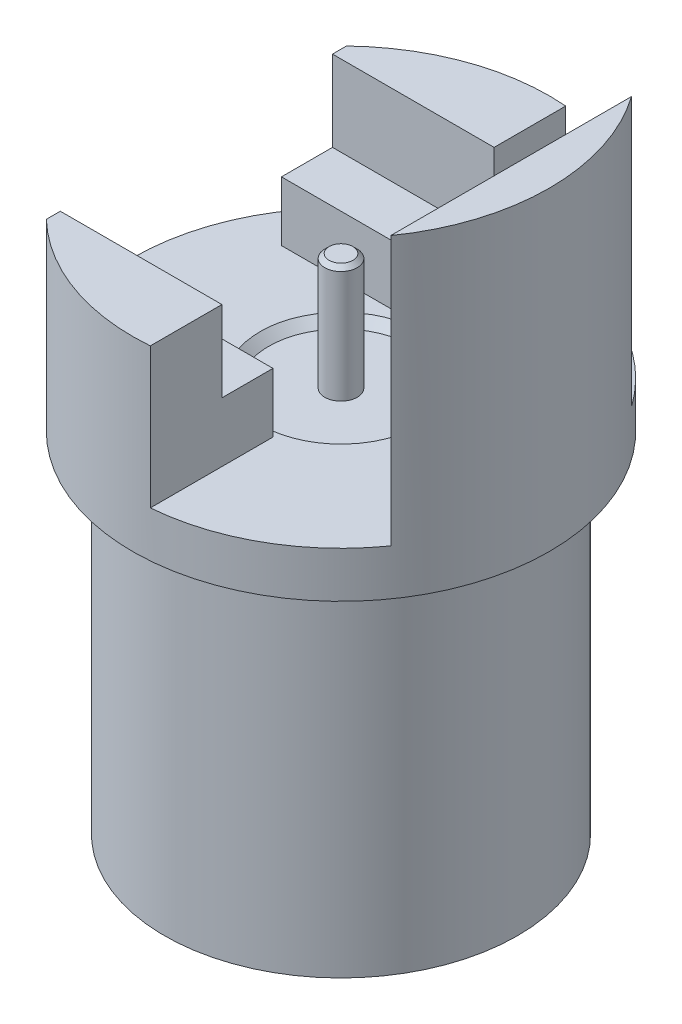
ISO-10303-21;
HEADER;
FILE_DESCRIPTION(('STEP AP214'),'2;1');
FILE_NAME('part.step','',(''),(''),'','','');
FILE_SCHEMA(('AUTOMOTIVE_DESIGN { 1 0 10303 214 1 1 1 1 }'));
ENDSEC;
DATA;
#1=APPLICATION_CONTEXT('core data for automotive mechanical design processes');
#2=APPLICATION_PROTOCOL_DEFINITION('international standard','automotive_design',2000,#1);
#3=PRODUCT_CONTEXT('',#1,'mechanical');
#4=PRODUCT('Part','Part','',(#3));
#5=PRODUCT_RELATED_PRODUCT_CATEGORY('part','',(#4));
#6=PRODUCT_DEFINITION_FORMATION('','',#4);
#7=PRODUCT_DEFINITION_CONTEXT('part definition',#1,'design');
#8=PRODUCT_DEFINITION('design','',#6,#7);
#9=PRODUCT_DEFINITION_SHAPE('','',#8);
#10=(LENGTH_UNIT() NAMED_UNIT(*) SI_UNIT(.MILLI.,.METRE.));
#11=(NAMED_UNIT(*) PLANE_ANGLE_UNIT() SI_UNIT($,.RADIAN.));
#12=(NAMED_UNIT(*) SI_UNIT($,.STERADIAN.) SOLID_ANGLE_UNIT());
#13=UNCERTAINTY_MEASURE_WITH_UNIT(LENGTH_MEASURE(1.E-05),#10,'distance_accuracy_value','');
#14=(GEOMETRIC_REPRESENTATION_CONTEXT(3) GLOBAL_UNCERTAINTY_ASSIGNED_CONTEXT((#13)) GLOBAL_UNIT_ASSIGNED_CONTEXT((#10,
#11,#12)) REPRESENTATION_CONTEXT('',''));
#15=CARTESIAN_POINT('',(0.,0.,0.));
#16=DIRECTION('',(0.,0.,1.));
#17=DIRECTION('',(1.,0.,0.));
#18=AXIS2_PLACEMENT_3D('',#15,#16,#17);
#19=CARTESIAN_POINT('',(-1.69999999999993,4.64,-2.44999999998904));
#20=DIRECTION('',(1.,0.,0.));
#21=DIRECTION('',(0.,0.,-1.));
#22=AXIS2_PLACEMENT_3D('',#19,#20,#21);
#23=PLANE('',#22);
#24=DIRECTION('',(0.,1.,0.));
#25=VECTOR('',#24,1.);
#26=CARTESIAN_POINT('',(-1.69999999999993,4.64,-1.6));
#27=LINE('',#26,#25);
#28=CARTESIAN_POINT('',(-1.69999999999993,5.34,-1.6));
#29=VERTEX_POINT('',#28);
#30=CARTESIAN_POINT('',(-1.69999999999993,6.29,-1.6));
#31=VERTEX_POINT('',#30);
#32=EDGE_CURVE('E295',#29,#31,#27,.T.);
#33=ORIENTED_EDGE('',*,*,#32,.T.);
#34=DIRECTION('',(0.,0.,-1.));
#35=VECTOR('',#34,1.);
#36=CARTESIAN_POINT('',(-1.69999999999993,6.29,-2.44999999998904));
#37=LINE('',#36,#35);
#38=CARTESIAN_POINT('',(-1.69999999999993,6.29,-1.76422787639891));
#39=VERTEX_POINT('',#38);
#40=EDGE_CURVE('E298',#31,#39,#37,.T.);
#41=ORIENTED_EDGE('',*,*,#40,.T.);
#42=DIRECTION('',(-4.24620830897646E-12,-1.,0.));
#43=VECTOR('',#42,1.);
#44=CARTESIAN_POINT('',(-1.69999999999993,1.52,-1.76422787641168));
#45=LINE('',#44,#43);
#46=CARTESIAN_POINT('',(-1.69999999999993,4.64,-1.76422787639891));
#47=VERTEX_POINT('',#46);
#48=EDGE_CURVE('E402',#39,#47,#45,.T.);
#49=ORIENTED_EDGE('',*,*,#48,.T.);
#50=DIRECTION('',(0.,0.,1.));
#51=VECTOR('',#50,1.);
#52=CARTESIAN_POINT('',(-1.69999999999993,4.64,-2.44999999998904));
#53=LINE('',#52,#51);
#54=CARTESIAN_POINT('',(-1.69999999999993,4.64,-1.));
#55=VERTEX_POINT('',#54);
#56=EDGE_CURVE('E318',#47,#55,#53,.T.);
#57=ORIENTED_EDGE('',*,*,#56,.T.);
#58=DIRECTION('',(0.,1.,0.));
#59=VECTOR('',#58,1.);
#60=CARTESIAN_POINT('',(-1.69999999999993,4.64,-1.));
#61=LINE('',#60,#59);
#62=CARTESIAN_POINT('',(-1.69999999999993,5.34,-1.));
#63=VERTEX_POINT('',#62);
#64=EDGE_CURVE('E281',#55,#63,#61,.T.);
#65=ORIENTED_EDGE('',*,*,#64,.T.);
#66=DIRECTION('',(0.,0.,-1.));
#67=VECTOR('',#66,1.);
#68=CARTESIAN_POINT('',(-1.69999999999993,5.34,-2.44999999998904));
#69=LINE('',#68,#67);
#70=EDGE_CURVE('E291',#63,#29,#69,.T.);
#71=ORIENTED_EDGE('',*,*,#70,.T.);
#72=EDGE_LOOP('',(#33,#41,#49,#57,#65,#71));
#73=FACE_BOUND('',#72,.T.);
#74=ADVANCED_FACE('F44',(#73),#23,.F.);
#75=CARTESIAN_POINT('',(0.,1.52,0.));
#76=DIRECTION('',(-4.24620830897646E-12,-1.,0.));
#77=DIRECTION('',(1.,-4.24620830897646E-12,0.));
#78=AXIS2_PLACEMENT_3D('',#75,#76,#77);
#79=CYLINDRICAL_SURFACE('',#78,0.43499999999397);
#80=CARTESIAN_POINT('',(5.39268455240795E-12,2.79000000000185,0.));
#81=DIRECTION('',(-4.24620830897646E-12,-1.,0.));
#82=DIRECTION('',(1.,-4.24620830897646E-12,0.));
#83=AXIS2_PLACEMENT_3D('',#80,#81,#82);
#84=CIRCLE('',#83,0.434999999994607);
#85=CARTESIAN_POINT('',(0.435,2.79,0.));
#86=VERTEX_POINT('',#85);
#87=EDGE_CURVE('E310',#86,#86,#84,.T.);
#88=ORIENTED_EDGE('',*,*,#87,.T.);
#89=EDGE_LOOP('',(#88));
#90=FACE_BOUND('',#89,.T.);
#91=CARTESIAN_POINT('',(6.66654704510089E-12,3.09000000000185,0.));
#92=DIRECTION('',(-4.24620830897646E-12,-1.,0.));
#93=DIRECTION('',(1.,-4.24620830897646E-12,0.));
#94=AXIS2_PLACEMENT_3D('',#91,#92,#93);
#95=CIRCLE('',#94,0.434999999993333);
#96=CARTESIAN_POINT('',(0.435,3.09,0.));
#97=VERTEX_POINT('',#96);
#98=EDGE_CURVE('E392',#97,#97,#95,.T.);
#99=ORIENTED_EDGE('',*,*,#98,.F.);
#100=EDGE_LOOP('',(#99));
#101=FACE_BOUND('',#100,.T.);
#102=ADVANCED_FACE('F46',(#90,#101),#79,.F.);
#103=CARTESIAN_POINT('',(0.435,3.08999999999948,0.));
#104=DIRECTION('',(-4.24620830897646E-12,-1.,0.));
#105=DIRECTION('',(1.,-4.24620830897646E-12,0.));
#106=AXIS2_PLACEMENT_3D('',#103,#104,#105);
#107=PLANE('',#106);
#108=ORIENTED_EDGE('',*,*,#98,.T.);
#109=EDGE_LOOP('',(#108));
#110=FACE_BOUND('',#109,.T.);
#111=CARTESIAN_POINT('',(6.66654704509647E-12,3.09000000000081,0.));
#112=DIRECTION('',(-4.24620830897646E-12,-1.,0.));
#113=DIRECTION('',(1.,-4.24620830897646E-12,0.));
#114=AXIS2_PLACEMENT_3D('',#111,#112,#113);
#115=CIRCLE('',#114,0.189999999993333);
#116=CARTESIAN_POINT('',(0.19,3.09,0.));
#117=VERTEX_POINT('',#116);
#118=EDGE_CURVE('E388',#117,#117,#115,.T.);
#119=ORIENTED_EDGE('',*,*,#118,.F.);
#120=EDGE_LOOP('',(#119));
#121=FACE_BOUND('',#120,.T.);
#122=ADVANCED_FACE('F234',(#110,#121),#107,.T.);
#123=CARTESIAN_POINT('',(0.,1.52,0.));
#124=DIRECTION('',(-4.24620830897646E-12,-1.,0.));
#125=DIRECTION('',(1.,-4.24620830897646E-12,0.));
#126=AXIS2_PLACEMENT_3D('',#123,#124,#125);
#127=CYLINDRICAL_SURFACE('',#126,0.189999999996263);
#128=ORIENTED_EDGE('',*,*,#118,.T.);
#129=EDGE_LOOP('',(#128));
#130=FACE_BOUND('',#129,.T.);
#131=CARTESIAN_POINT('',(8.06779578708953E-13,1.71000000000081,0.));
#132=DIRECTION('',(-4.24620830897646E-12,-1.,0.));
#133=DIRECTION('',(1.,-4.24620830897646E-12,0.));
#134=AXIS2_PLACEMENT_3D('',#131,#132,#133);
#135=CIRCLE('',#134,0.189999999999193);
#136=CARTESIAN_POINT('',(0.19,1.71,0.));
#137=VERTEX_POINT('',#136);
#138=EDGE_CURVE('E384',#137,#137,#135,.T.);
#139=ORIENTED_EDGE('',*,*,#138,.F.);
#140=EDGE_LOOP('',(#139));
#141=FACE_BOUND('',#140,.T.);
#142=ADVANCED_FACE('F231',(#130,#141),#127,.T.);
#143=CARTESIAN_POINT('',(0.,1.71,0.));
#144=DIRECTION('',(-4.24620830897646E-12,-1.,0.));
#145=DIRECTION('',(1.,-4.24620830897646E-12,0.));
#146=AXIS2_PLACEMENT_3D('',#143,#144,#145);
#147=SPHERICAL_SURFACE('',#146,0.19);
#148=ORIENTED_EDGE('',*,*,#138,.T.);
#149=EDGE_LOOP('',(#148));
#150=FACE_BOUND('',#149,.T.);
#151=ADVANCED_FACE('F227',(#150),#147,.T.);
#152=CARTESIAN_POINT('',(1.86408544764074E-11,5.91000000000017,0.));
#153=DIRECTION('',(4.24620830897646E-12,1.,0.));
#154=DIRECTION('',(-1.,4.24620830897646E-12,0.));
#155=AXIS2_PLACEMENT_3D('',#152,#153,#154);
#156=PLANE('',#155);
#157=CARTESIAN_POINT('',(1.86408544764086E-11,5.91000000000045,0.));
#158=DIRECTION('',(-4.24620830897646E-12,-1.,0.));
#159=DIRECTION('',(1.,-4.24620830897646E-12,0.));
#160=AXIS2_PLACEMENT_3D('',#157,#158,#159);
#161=CIRCLE('',#160,0.139999999981213);
#162=CARTESIAN_POINT('',(0.139999999999854,5.90999999999985,0.));
#163=VERTEX_POINT('',#162);
#164=EDGE_CURVE('E380',#163,#163,#161,.T.);
#165=ORIENTED_EDGE('',*,*,#164,.F.);
#166=EDGE_LOOP('',(#165));
#167=FACE_BOUND('',#166,.T.);
#168=ADVANCED_FACE('F223',(#167),#156,.T.);
#169=CARTESIAN_POINT('',(1.84285440609613E-11,5.86000000000081,0.));
#170=DIRECTION('',(-4.24620830897646E-12,-1.,0.));
#171=DIRECTION('',(1.,-4.24620830897646E-12,0.));
#172=AXIS2_PLACEMENT_3D('',#169,#170,#171);
#173=CONICAL_SURFACE('',#172,0.189999999981571,0.78539816340464);
#174=ORIENTED_EDGE('',*,*,#164,.T.);
#175=EDGE_LOOP('',(#174));
#176=FACE_BOUND('',#175,.T.);
#177=CARTESIAN_POINT('',(1.84285440609613E-11,5.86000000000081,0.));
#178=DIRECTION('',(-4.24620830897646E-12,-1.,0.));
#179=DIRECTION('',(1.,-4.24620830897646E-12,0.));
#180=AXIS2_PLACEMENT_3D('',#177,#178,#179);
#181=CIRCLE('',#180,0.189999999981571);
#182=CARTESIAN_POINT('',(0.19,5.86,0.));
#183=VERTEX_POINT('',#182);
#184=EDGE_CURVE('E376',#183,#183,#181,.T.);
#185=ORIENTED_EDGE('',*,*,#184,.F.);
#186=EDGE_LOOP('',(#185));
#187=FACE_BOUND('',#186,.T.);
#188=ADVANCED_FACE('F219',(#176,#187),#173,.T.);
#189=CARTESIAN_POINT('',(0.,1.52,0.));
#190=DIRECTION('',(-4.24620830897646E-12,-1.,0.));
#191=DIRECTION('',(1.,-4.24620830897646E-12,0.));
#192=AXIS2_PLACEMENT_3D('',#189,#190,#191);
#193=CYLINDRICAL_SURFACE('',#192,0.189999999984374);
#194=ORIENTED_EDGE('',*,*,#184,.T.);
#195=EDGE_LOOP('',(#194));
#196=FACE_BOUND('',#195,.T.);
#197=CARTESIAN_POINT('',(1.28235490931123E-11,4.54000000000081,0.));
#198=DIRECTION('',(-4.24620830897646E-12,-1.,0.));
#199=DIRECTION('',(1.,-4.24620830897646E-12,0.));
#200=AXIS2_PLACEMENT_3D('',#197,#198,#199);
#201=CIRCLE('',#200,0.189999999987176);
#202=CARTESIAN_POINT('',(0.19,4.54,0.));
#203=VERTEX_POINT('',#202);
#204=EDGE_CURVE('E372',#203,#203,#201,.T.);
#205=ORIENTED_EDGE('',*,*,#204,.F.);
#206=EDGE_LOOP('',(#205));
#207=FACE_BOUND('',#206,.T.);
#208=ADVANCED_FACE('F215',(#196,#207),#193,.T.);
#209=CARTESIAN_POINT('',(0.19,4.5400000000014,0.));
#210=DIRECTION('',(4.24620830897646E-12,1.,0.));
#211=DIRECTION('',(-1.,4.24620830897646E-12,0.));
#212=AXIS2_PLACEMENT_3D('',#209,#210,#211);
#213=PLANE('',#212);
#214=ORIENTED_EDGE('',*,*,#204,.T.);
#215=EDGE_LOOP('',(#214));
#216=FACE_BOUND('',#215,.T.);
#217=CARTESIAN_POINT('',(1.28235490931242E-11,4.54000000000361,0.));
#218=DIRECTION('',(-4.24620830897646E-12,-1.,0.));
#219=DIRECTION('',(1.,-4.24620830897646E-12,0.));
#220=AXIS2_PLACEMENT_3D('',#217,#218,#219);
#221=CIRCLE('',#220,0.849999999987356);
#222=CARTESIAN_POINT('',(0.85000000000018,4.54,0.));
#223=VERTEX_POINT('',#222);
#224=EDGE_CURVE('E189',#223,#223,#221,.T.);
#225=ORIENTED_EDGE('',*,*,#224,.F.);
#226=EDGE_LOOP('',(#225));
#227=FACE_BOUND('',#226,.T.);
#228=ADVANCED_FACE('F210',(#216,#227),#213,.T.);
#229=CARTESIAN_POINT('',(1.32481699240237E-11,4.64000000000403,0.));
#230=DIRECTION('',(4.24620830897646E-12,1.,0.));
#231=DIRECTION('',(-1.,4.24620830897646E-12,0.));
#232=AXIS2_PLACEMENT_3D('',#229,#230,#231);
#233=CONICAL_SURFACE('',#232,0.949999999986862,0.78539816339285);
#234=ORIENTED_EDGE('',*,*,#224,.T.);
#235=EDGE_LOOP('',(#234));
#236=FACE_BOUND('',#235,.T.);
#237=CARTESIAN_POINT('',(1.32481699240237E-11,4.64000000000403,0.));
#238=DIRECTION('',(-4.24620830897646E-12,-1.,0.));
#239=DIRECTION('',(1.,-4.24620830897646E-12,0.));
#240=AXIS2_PLACEMENT_3D('',#237,#238,#239);
#241=CIRCLE('',#240,0.949999999986862);
#242=CARTESIAN_POINT('',(-0.930896385028714,4.64000000000001,-0.190000067025787));
#243=VERTEX_POINT('',#242);
#244=CARTESIAN_POINT('',(-0.930851980299921,4.63999999994953,0.189999988622163));
#245=VERTEX_POINT('',#244);
#246=EDGE_CURVE('E183',#243,#245,#241,.T.);
#247=ORIENTED_EDGE('',*,*,#246,.F.);
#248=CARTESIAN_POINT('',(0.,4.64,0.95));
#249=CARTESIAN_POINT('',(-0.188680468157453,4.64,0.95));
#250=CARTESIAN_POINT('',(-0.363549260746835,4.64,0.877685555885722));
#251=CARTESIAN_POINT('',(-0.537665324730369,4.64,0.805682391731092));
#252=CARTESIAN_POINT('',(-0.67175144212722,4.64,0.67175144212722));
#253=CARTESIAN_POINT('',(-0.80505929192317,4.64,0.538597859493607));
#254=CARTESIAN_POINT('',(-0.877685555885722,4.64,0.363549260746835));
#255=CARTESIAN_POINT('',(-0.949890279801376,4.64,0.189516685549937));
#256=CARTESIAN_POINT('',(-0.95,4.64,0.));
#257=CARTESIAN_POINT('',(-0.95010908335659,4.64,-0.188416685795714));
#258=CARTESIAN_POINT('',(-0.877685555885722,4.64,-0.363549260746835));
#259=CARTESIAN_POINT('',(-0.805682391731059,4.64,-0.537665324730422));
#260=CARTESIAN_POINT('',(-0.67175144212722,4.64,-0.67175144212722));
#261=CARTESIAN_POINT('',(-0.538597859493553,4.64,-0.805059291923206));
#262=CARTESIAN_POINT('',(-0.363549260746835,4.64,-0.877685555885722));
#263=CARTESIAN_POINT('',(-0.189252230709805,4.64,-0.95));
#264=CARTESIAN_POINT('',(0.,4.64,-0.95));
#265=B_SPLINE_CURVE_WITH_KNOTS('',2,(#248,#249,#250,#251,#252,#253,#254,#255,#256,#257,#258,
#259,#260,#261,#262,#263,#264),.UNSPECIFIED.,.F.,.F.,(3,2,2,2,2,2,2,2,3),(0.,0.125,0.25,0.375,
0.5,0.625,0.75,0.875,1.),.UNSPECIFIED.);
#266=EDGE_CURVE('E186',#245,#243,#265,.T.);
#267=ORIENTED_EDGE('',*,*,#266,.F.);
#268=EDGE_LOOP('',(#247,#267));
#269=FACE_BOUND('',#268,.T.);
#270=ADVANCED_FACE('F192',(#236,#269),#233,.F.);
#271=CARTESIAN_POINT('',(2.45,7.79999999999905,0.));
#272=DIRECTION('',(4.24620830897646E-12,1.,0.));
#273=DIRECTION('',(-1.,4.24620830897646E-12,0.));
#274=AXIS2_PLACEMENT_3D('',#271,#272,#273);
#275=PLANE('',#274);
#276=DIRECTION('',(0.,0.,1.));
#277=VECTOR('',#276,1.);
#278=CARTESIAN_POINT('',(2.00000000000012,7.8,-2.44999999998904));
#279=LINE('',#278,#277);
#280=CARTESIAN_POINT('',(2.00000000000012,7.8,-1.41509716977576));
#281=VERTEX_POINT('',#280);
#282=CARTESIAN_POINT('',(2.00000000000012,7.8,1.41509716977576));
#283=VERTEX_POINT('',#282);
#284=EDGE_CURVE('E306',#281,#283,#279,.T.);
#285=ORIENTED_EDGE('',*,*,#284,.T.);
#286=CARTESIAN_POINT('',(2.66661881804164E-11,7.8000000000104,0.));
#287=DIRECTION('',(-4.24620830897646E-12,-1.,0.));
#288=DIRECTION('',(1.,-4.24620830897646E-12,0.));
#289=AXIS2_PLACEMENT_3D('',#286,#287,#288);
#290=CIRCLE('',#289,2.44999999997333);
#291=EDGE_CURVE('E194',#281,#283,#290,.T.);
#292=ORIENTED_EDGE('',*,*,#291,.F.);
#293=EDGE_LOOP('',(#285,#292));
#294=FACE_BOUND('',#293,.T.);
#295=ADVANCED_FACE('F209',(#294),#275,.T.);
#296=CARTESIAN_POINT('',(0.,1.52,0.));
#297=DIRECTION('',(-4.24620830897646E-12,-1.,0.));
#298=DIRECTION('',(1.,-4.24620830897646E-12,0.));
#299=AXIS2_PLACEMENT_3D('',#296,#297,#298);
#300=CYLINDRICAL_SURFACE('',#299,2.44999999998119);
#301=CARTESIAN_POINT('',(2.02544136338177E-11,6.29,0.));
#302=DIRECTION('',(0.,-1.,0.));
#303=DIRECTION('',(0.,0.,-1.));
#304=AXIS2_PLACEMENT_3D('',#301,#302,#303);
#305=CIRCLE('',#304,2.44999999998119);
#306=CARTESIAN_POINT('',(0.199999999999995,6.29,-2.44182308939827));
#307=VERTEX_POINT('',#306);
#308=EDGE_CURVE('E302',#307,#39,#305,.F.);
#309=ORIENTED_EDGE('',*,*,#308,.F.);
#310=DIRECTION('',(-4.24620830897646E-12,-1.,0.));
#311=VECTOR('',#310,1.);
#312=CARTESIAN_POINT('',(0.199999999999995,1.52,-2.44182308939608));
#313=LINE('',#312,#311);
#314=CARTESIAN_POINT('',(0.199999999999995,4.64,-2.44182308939717));
#315=VERTEX_POINT('',#314);
#316=EDGE_CURVE('E412',#315,#307,#313,.F.);
#317=ORIENTED_EDGE('',*,*,#316,.F.);
#318=CARTESIAN_POINT('',(1.32481699240066E-11,4.64,0.));
#319=DIRECTION('',(0.,-1.,0.));
#320=DIRECTION('',(0.,0.,-1.));
#321=AXIS2_PLACEMENT_3D('',#318,#319,#320);
#322=CIRCLE('',#321,2.44999999998119);
#323=CARTESIAN_POINT('',(2.00000000000012,4.64,-1.41509716979448));
#324=VERTEX_POINT('',#323);
#325=EDGE_CURVE('E405',#324,#315,#322,.F.);
#326=ORIENTED_EDGE('',*,*,#325,.F.);
#327=DIRECTION('',(-4.24620830897646E-12,-1.,0.));
#328=VECTOR('',#327,1.);
#329=CARTESIAN_POINT('',(2.00000000000012,1.52,-1.41509716977576));
#330=LINE('',#329,#328);
#331=EDGE_CURVE('E408',#281,#324,#330,.T.);
#332=ORIENTED_EDGE('',*,*,#331,.F.);
#333=ORIENTED_EDGE('',*,*,#291,.T.);
#334=DIRECTION('',(-4.24620830897646E-12,-1.,0.));
#335=VECTOR('',#334,1.);
#336=CARTESIAN_POINT('',(2.00000000000012,1.52,1.41509716977576));
#337=LINE('',#336,#335);
#338=CARTESIAN_POINT('',(2.00000000000012,4.64,1.41509716979448));
#339=VERTEX_POINT('',#338);
#340=EDGE_CURVE('E56',#339,#283,#337,.F.);
#341=ORIENTED_EDGE('',*,*,#340,.F.);
#342=CARTESIAN_POINT('',(0.199999999999995,4.64,2.44182308939717));
#343=VERTEX_POINT('',#342);
#344=EDGE_CURVE('E409',#343,#339,#322,.F.);
#345=ORIENTED_EDGE('',*,*,#344,.F.);
#346=DIRECTION('',(-4.24620830897646E-12,-1.,0.));
#347=VECTOR('',#346,1.);
#348=CARTESIAN_POINT('',(0.199999999999995,1.52,2.44182308939608));
#349=LINE('',#348,#347);
#350=CARTESIAN_POINT('',(0.199999999999995,6.29,2.44182308939827));
#351=VERTEX_POINT('',#350);
#352=EDGE_CURVE('E11',#351,#343,#349,.T.);
#353=ORIENTED_EDGE('',*,*,#352,.F.);
#354=CARTESIAN_POINT('',(2.02544136338177E-11,6.29,0.));
#355=DIRECTION('',(0.,-1.,0.));
#356=DIRECTION('',(0.,0.,-1.));
#357=AXIS2_PLACEMENT_3D('',#354,#355,#356);
#358=CIRCLE('',#357,2.44999999998119);
#359=CARTESIAN_POINT('',(-1.69999999999993,6.29,1.76422787639891));
#360=VERTEX_POINT('',#359);
#361=EDGE_CURVE('E284',#360,#351,#358,.F.);
#362=ORIENTED_EDGE('',*,*,#361,.F.);
#363=DIRECTION('',(-4.24620830897646E-12,-1.,0.));
#364=VECTOR('',#363,1.);
#365=CARTESIAN_POINT('',(-1.69999999999993,1.52,1.76422787641168));
#366=LINE('',#365,#364);
#367=CARTESIAN_POINT('',(-1.69999999999993,4.64,1.76422787639891));
#368=VERTEX_POINT('',#367);
#369=EDGE_CURVE('E398',#368,#360,#366,.F.);
#370=ORIENTED_EDGE('',*,*,#369,.F.);
#371=CARTESIAN_POINT('',(1.32481699240066E-11,4.64,0.));
#372=DIRECTION('',(0.,-1.,0.));
#373=DIRECTION('',(0.,0.,-1.));
#374=AXIS2_PLACEMENT_3D('',#371,#372,#373);
#375=CIRCLE('',#374,2.44999999998119);
#376=EDGE_CURVE('E395',#47,#368,#375,.F.);
#377=ORIENTED_EDGE('',*,*,#376,.F.);
#378=ORIENTED_EDGE('',*,*,#48,.F.);
#379=EDGE_LOOP('',(#309,#317,#326,#332,#333,#341,#345,#353,#362,#370,#377,#378));
#380=FACE_BOUND('',#379,.T.);
#381=CARTESIAN_POINT('',(1.09552174372035E-11,4.1000000000104,0.));
#382=DIRECTION('',(-4.24620830897646E-12,-1.,0.));
#383=DIRECTION('',(1.,-4.24620830897646E-12,0.));
#384=AXIS2_PLACEMENT_3D('',#381,#382,#383);
#385=CIRCLE('',#384,2.44999999998904);
#386=CARTESIAN_POINT('',(2.45,4.1,0.));
#387=VERTEX_POINT('',#386);
#388=EDGE_CURVE('E361',#387,#387,#385,.T.);
#389=ORIENTED_EDGE('',*,*,#388,.F.);
#390=EDGE_LOOP('',(#389));
#391=FACE_BOUND('',#390,.T.);
#392=ADVANCED_FACE('F431',(#380,#391),#300,.T.);
#393=CARTESIAN_POINT('',(2.075,4.1000000000008,0.));
#394=DIRECTION('',(-4.24620830897646E-12,-1.,0.));
#395=DIRECTION('',(1.,-4.24620830897646E-12,0.));
#396=AXIS2_PLACEMENT_3D('',#393,#394,#395);
#397=PLANE('',#396);
#398=ORIENTED_EDGE('',*,*,#388,.T.);
#399=EDGE_LOOP('',(#398));
#400=FACE_BOUND('',#399,.T.);
#401=CARTESIAN_POINT('',(1.09552174371967E-11,4.10000000000881,0.));
#402=DIRECTION('',(-4.24620830897646E-12,-1.,0.));
#403=DIRECTION('',(1.,-4.24620830897646E-12,0.));
#404=AXIS2_PLACEMENT_3D('',#401,#402,#403);
#405=CIRCLE('',#404,2.07499999998904);
#406=CARTESIAN_POINT('',(2.075,4.1,0.));
#407=VERTEX_POINT('',#406);
#408=EDGE_CURVE('E357',#407,#407,#405,.T.);
#409=ORIENTED_EDGE('',*,*,#408,.F.);
#410=EDGE_LOOP('',(#409));
#411=FACE_BOUND('',#410,.T.);
#412=ADVANCED_FACE('F439',(#400,#411),#397,.T.);
#413=CARTESIAN_POINT('',(0.,1.52,0.));
#414=DIRECTION('',(-4.24620830897646E-12,-1.,0.));
#415=DIRECTION('',(1.,-4.24620830897646E-12,0.));
#416=AXIS2_PLACEMENT_3D('',#413,#414,#415);
#417=CYLINDRICAL_SURFACE('',#416,2.07499999999775);
#418=ORIENTED_EDGE('',*,*,#408,.T.);
#419=EDGE_LOOP('',(#418));
#420=FACE_BOUND('',#419,.T.);
#421=CARTESIAN_POINT('',(-6.45423662960681E-12,8.8108773749207E-12,0.));
#422=DIRECTION('',(-4.24620830897646E-12,-1.,0.));
#423=DIRECTION('',(1.,-4.24620830897646E-12,0.));
#424=AXIS2_PLACEMENT_3D('',#421,#422,#423);
#425=CIRCLE('',#424,2.07500000000645);
#426=CARTESIAN_POINT('',(2.075,0.,0.));
#427=VERTEX_POINT('',#426);
#428=EDGE_CURVE('E353',#427,#427,#425,.T.);
#429=ORIENTED_EDGE('',*,*,#428,.F.);
#430=EDGE_LOOP('',(#429));
#431=FACE_BOUND('',#430,.T.);
#432=ADVANCED_FACE('F443',(#420,#431),#417,.T.);
#433=CARTESIAN_POINT('',(2.075,-2.78334574754323E-13,0.));
#434=DIRECTION('',(-4.24620830897646E-12,-1.,0.));
#435=DIRECTION('',(1.,-4.24620830897646E-12,0.));
#436=AXIS2_PLACEMENT_3D('',#433,#434,#435);
#437=PLANE('',#436);
#438=ORIENTED_EDGE('',*,*,#428,.T.);
#439=EDGE_LOOP('',(#438));
#440=FACE_BOUND('',#439,.T.);
#441=CARTESIAN_POINT('',(-6.45423662960918E-12,8.25403113913215E-12,0.));
#442=DIRECTION('',(-4.24620830897646E-12,-1.,0.));
#443=DIRECTION('',(1.,-4.24620830897646E-12,0.));
#444=AXIS2_PLACEMENT_3D('',#441,#442,#443);
#445=CIRCLE('',#444,1.94500000000645);
#446=CARTESIAN_POINT('',(1.945,0.,0.));
#447=VERTEX_POINT('',#446);
#448=EDGE_CURVE('E349',#447,#447,#445,.T.);
#449=ORIENTED_EDGE('',*,*,#448,.F.);
#450=EDGE_LOOP('',(#449));
#451=FACE_BOUND('',#450,.T.);
#452=ADVANCED_FACE('F449',(#440,#451),#437,.T.);
#453=CARTESIAN_POINT('',(-5.9022295494445E-12,0.130000000007722,0.));
#454=DIRECTION('',(-4.24620830897646E-12,-1.,0.));
#455=DIRECTION('',(1.,-4.24620830897646E-12,0.));
#456=AXIS2_PLACEMENT_3D('',#453,#454,#455);
#457=CONICAL_SURFACE('',#456,1.81500000000592,0.785398163401546);
#458=ORIENTED_EDGE('',*,*,#448,.T.);
#459=EDGE_LOOP('',(#458));
#460=FACE_BOUND('',#459,.T.);
#461=CARTESIAN_POINT('',(-5.9022295494445E-12,0.130000000007722,0.));
#462=DIRECTION('',(-4.24620830897646E-12,-1.,0.));
#463=DIRECTION('',(1.,-4.24620830897646E-12,0.));
#464=AXIS2_PLACEMENT_3D('',#461,#462,#463);
#465=CIRCLE('',#464,1.81500000000592);
#466=CARTESIAN_POINT('',(1.81500000000001,0.130000000000015,0.));
#467=VERTEX_POINT('',#466);
#468=EDGE_CURVE('E345',#467,#467,#465,.T.);
#469=ORIENTED_EDGE('',*,*,#468,.F.);
#470=EDGE_LOOP('',(#469));
#471=FACE_BOUND('',#470,.T.);
#472=ADVANCED_FACE('F453',(#460,#471),#457,.F.);
#473=CARTESIAN_POINT('',(0.,1.52,0.));
#474=DIRECTION('',(-4.24620830897646E-12,-1.,0.));
#475=DIRECTION('',(1.,-4.24620830897646E-12,0.));
#476=AXIS2_PLACEMENT_3D('',#473,#474,#475);
#477=CYLINDRICAL_SURFACE('',#476,1.81500000000429);
#478=ORIENTED_EDGE('',*,*,#468,.T.);
#479=EDGE_LOOP('',(#478));
#480=FACE_BOUND('',#479,.T.);
#481=CARTESIAN_POINT('',(-2.6751112346225E-12,0.890000000007693,0.));
#482=DIRECTION('',(-4.24620830897646E-12,-1.,0.));
#483=DIRECTION('',(1.,-4.24620830897646E-12,0.));
#484=AXIS2_PLACEMENT_3D('',#481,#482,#483);
#485=CIRCLE('',#484,1.81500000000265);
#486=CARTESIAN_POINT('',(1.81499999999998,0.889999999999986,0.));
#487=VERTEX_POINT('',#486);
#488=EDGE_CURVE('E341',#487,#487,#485,.T.);
#489=ORIENTED_EDGE('',*,*,#488,.F.);
#490=EDGE_LOOP('',(#489));
#491=FACE_BOUND('',#490,.T.);
#492=ADVANCED_FACE('F457',(#480,#491),#477,.F.);
#493=CARTESIAN_POINT('',(-7.64317495588269E-13,1.34000000000648,0.));
#494=DIRECTION('',(-4.24620830897646E-12,-1.,0.));
#495=DIRECTION('',(1.,-4.24620830897646E-12,0.));
#496=AXIS2_PLACEMENT_3D('',#493,#494,#495);
#497=CONICAL_SURFACE('',#496,1.52500000000076,0.57245981382225);
#498=ORIENTED_EDGE('',*,*,#488,.T.);
#499=EDGE_LOOP('',(#498));
#500=FACE_BOUND('',#499,.T.);
#501=CARTESIAN_POINT('',(-7.64317495588269E-13,1.34000000000648,0.));
#502=DIRECTION('',(-4.24620830897646E-12,-1.,0.));
#503=DIRECTION('',(1.,-4.24620830897646E-12,0.));
#504=AXIS2_PLACEMENT_3D('',#501,#502,#503);
#505=CIRCLE('',#504,1.52500000000076);
#506=CARTESIAN_POINT('',(1.525,1.34,0.));
#507=VERTEX_POINT('',#506);
#508=EDGE_CURVE('E337',#507,#507,#505,.T.);
#509=ORIENTED_EDGE('',*,*,#508,.F.);
#510=EDGE_LOOP('',(#509));
#511=FACE_BOUND('',#510,.T.);
#512=ADVANCED_FACE('F461',(#500,#511),#497,.F.);
#513=CARTESIAN_POINT('',(0.,1.52,0.));
#514=DIRECTION('',(-4.24620830897646E-12,-1.,0.));
#515=DIRECTION('',(1.,-4.24620830897646E-12,0.));
#516=AXIS2_PLACEMENT_3D('',#513,#514,#515);
#517=CYLINDRICAL_SURFACE('',#516,1.52499999999911);
#518=ORIENTED_EDGE('',*,*,#508,.T.);
#519=EDGE_LOOP('',(#518));
#520=FACE_BOUND('',#519,.T.);
#521=CARTESIAN_POINT('',(2.53675574490724E-12,2.11741669751448,0.));
#522=DIRECTION('',(-4.24620830897646E-12,-1.,0.));
#523=DIRECTION('',(1.,-4.24620830897646E-12,0.));
#524=AXIS2_PLACEMENT_3D('',#521,#522,#523);
#525=CIRCLE('',#524,1.52499999999746);
#526=CARTESIAN_POINT('',(1.525,2.117416697508,0.));
#527=VERTEX_POINT('',#526);
#528=EDGE_CURVE('E333',#527,#527,#525,.T.);
#529=ORIENTED_EDGE('',*,*,#528,.F.);
#530=EDGE_LOOP('',(#529));
#531=FACE_BOUND('',#530,.T.);
#532=ADVANCED_FACE('F465',(#520,#531),#517,.F.);
#533=CARTESIAN_POINT('',(3.01480789940196E-12,2.23000000000675,0.));
#534=DIRECTION('',(4.24620830897646E-12,1.,0.));
#535=DIRECTION('',(-1.,4.24620830897646E-12,0.));
#536=AXIS2_PLACEMENT_3D('',#533,#534,#535);
#537=CONICAL_SURFACE('',#536,1.58999999999699,0.523598775593965);
#538=ORIENTED_EDGE('',*,*,#528,.T.);
#539=EDGE_LOOP('',(#538));
#540=FACE_BOUND('',#539,.T.);
#541=CARTESIAN_POINT('',(3.01480789940196E-12,2.23000000000675,0.));
#542=DIRECTION('',(-4.24620830897646E-12,-1.,0.));
#543=DIRECTION('',(1.,-4.24620830897646E-12,0.));
#544=AXIS2_PLACEMENT_3D('',#541,#542,#543);
#545=CIRCLE('',#544,1.58999999999699);
#546=CARTESIAN_POINT('',(1.59,2.23,0.));
#547=VERTEX_POINT('',#546);
#548=EDGE_CURVE('E329',#547,#547,#545,.T.);
#549=ORIENTED_EDGE('',*,*,#548,.F.);
#550=EDGE_LOOP('',(#549));
#551=FACE_BOUND('',#550,.T.);
#552=ADVANCED_FACE('F469',(#540,#551),#537,.F.);
#553=CARTESIAN_POINT('',(0.,1.52,0.));
#554=DIRECTION('',(-4.24620830897646E-12,-1.,0.));
#555=DIRECTION('',(1.,-4.24620830897646E-12,0.));
#556=AXIS2_PLACEMENT_3D('',#553,#554,#555);
#557=CYLINDRICAL_SURFACE('',#556,1.5899999999958);
#558=ORIENTED_EDGE('',*,*,#548,.T.);
#559=EDGE_LOOP('',(#558));
#560=FACE_BOUND('',#559,.T.);
#561=CARTESIAN_POINT('',(5.39268455242877E-12,2.79000000000675,0.));
#562=DIRECTION('',(-4.24620830897646E-12,-1.,0.));
#563=DIRECTION('',(1.,-4.24620830897646E-12,0.));
#564=AXIS2_PLACEMENT_3D('',#561,#562,#563);
#565=CIRCLE('',#564,1.58999999999461);
#566=CARTESIAN_POINT('',(1.59,2.79,0.));
#567=VERTEX_POINT('',#566);
#568=EDGE_CURVE('E325',#567,#567,#565,.T.);
#569=ORIENTED_EDGE('',*,*,#568,.F.);
#570=EDGE_LOOP('',(#569));
#571=FACE_BOUND('',#570,.T.);
#572=ADVANCED_FACE('F263',(#560,#571),#557,.F.);
#573=CARTESIAN_POINT('',(1.59,2.78999999999755,0.));
#574=DIRECTION('',(-4.24620830897646E-12,-1.,0.));
#575=DIRECTION('',(1.,-4.24620830897646E-12,0.));
#576=AXIS2_PLACEMENT_3D('',#573,#574,#575);
#577=PLANE('',#576);
#578=ORIENTED_EDGE('',*,*,#568,.T.);
#579=EDGE_LOOP('',(#578));
#580=FACE_BOUND('',#579,.T.);
#581=ORIENTED_EDGE('',*,*,#87,.F.);
#582=EDGE_LOOP('',(#581));
#583=FACE_BOUND('',#582,.T.);
#584=ADVANCED_FACE('F255',(#580,#583),#577,.T.);
#585=DIRECTION('',(0.,0.,-1.));
#586=VECTOR('',#585,1.);
#587=CARTESIAN_POINT('',(-1.69999999999993,5.34,-2.44999999998904));
#588=LINE('',#587,#586);
#589=CARTESIAN_POINT('',(-1.69999999999993,5.34,1.6));
#590=VERTEX_POINT('',#589);
#591=CARTESIAN_POINT('',(-1.69999999999993,5.34,1.));
#592=VERTEX_POINT('',#591);
#593=EDGE_CURVE('E268',#590,#592,#588,.T.);
#594=ORIENTED_EDGE('',*,*,#593,.T.);
#595=DIRECTION('',(0.,-1.,0.));
#596=VECTOR('',#595,1.);
#597=CARTESIAN_POINT('',(-1.69999999999993,4.64,1.));
#598=LINE('',#597,#596);
#599=CARTESIAN_POINT('',(-1.69999999999993,4.64,1.));
#600=VERTEX_POINT('',#599);
#601=EDGE_CURVE('E270',#592,#600,#598,.T.);
#602=ORIENTED_EDGE('',*,*,#601,.T.);
#603=EDGE_CURVE('E305',#600,#368,#53,.T.);
#604=ORIENTED_EDGE('',*,*,#603,.T.);
#605=ORIENTED_EDGE('',*,*,#369,.T.);
#606=DIRECTION('',(0.,0.,-1.));
#607=VECTOR('',#606,1.);
#608=CARTESIAN_POINT('',(-1.69999999999993,6.29,-2.44999999998904));
#609=LINE('',#608,#607);
#610=CARTESIAN_POINT('',(-1.69999999999993,6.29,1.6));
#611=VERTEX_POINT('',#610);
#612=EDGE_CURVE('E687',#360,#611,#609,.T.);
#613=ORIENTED_EDGE('',*,*,#612,.T.);
#614=DIRECTION('',(0.,-1.,0.));
#615=VECTOR('',#614,1.);
#616=CARTESIAN_POINT('',(-1.69999999999993,4.64,1.6));
#617=LINE('',#616,#615);
#618=EDGE_CURVE('E273',#611,#590,#617,.T.);
#619=ORIENTED_EDGE('',*,*,#618,.T.);
#620=EDGE_LOOP('',(#594,#602,#604,#605,#613,#619));
#621=FACE_BOUND('',#620,.T.);
#622=ADVANCED_FACE('F247',(#621),#23,.F.);
#623=CARTESIAN_POINT('',(0.199999999999995,4.64,-2.44999999998904));
#624=DIRECTION('',(-1.,0.,0.));
#625=DIRECTION('',(0.,0.,1.));
#626=AXIS2_PLACEMENT_3D('',#623,#624,#625);
#627=PLANE('',#626);
#628=ORIENTED_EDGE('',*,*,#316,.T.);
#629=DIRECTION('',(0.,0.,-1.));
#630=VECTOR('',#629,1.);
#631=CARTESIAN_POINT('',(0.199999999999995,6.29,-2.44182308941498));
#632=LINE('',#631,#630);
#633=CARTESIAN_POINT('',(0.199999999999995,6.29,-1.6));
#634=VERTEX_POINT('',#633);
#635=EDGE_CURVE('E678',#634,#307,#632,.T.);
#636=ORIENTED_EDGE('',*,*,#635,.F.);
#637=DIRECTION('',(0.,1.,0.));
#638=VECTOR('',#637,1.);
#639=CARTESIAN_POINT('',(0.199999999999995,6.29,-1.6));
#640=LINE('',#639,#638);
#641=CARTESIAN_POINT('',(0.199999999999995,5.34,-1.6));
#642=VERTEX_POINT('',#641);
#643=EDGE_CURVE('E664',#642,#634,#640,.T.);
#644=ORIENTED_EDGE('',*,*,#643,.F.);
#645=DIRECTION('',(0.,0.,-1.));
#646=VECTOR('',#645,1.);
#647=CARTESIAN_POINT('',(0.199999999999995,5.34,-1.6));
#648=LINE('',#647,#646);
#649=CARTESIAN_POINT('',(0.199999999999995,5.34,-1.));
#650=VERTEX_POINT('',#649);
#651=EDGE_CURVE('E671',#650,#642,#648,.T.);
#652=ORIENTED_EDGE('',*,*,#651,.F.);
#653=DIRECTION('',(0.,1.,0.));
#654=VECTOR('',#653,1.);
#655=CARTESIAN_POINT('',(0.199999999999995,5.34,-1.));
#656=LINE('',#655,#654);
#657=CARTESIAN_POINT('',(0.199999999999995,4.64,-1.));
#658=VERTEX_POINT('',#657);
#659=EDGE_CURVE('E676',#658,#650,#656,.T.);
#660=ORIENTED_EDGE('',*,*,#659,.F.);
#661=DIRECTION('',(0.,0.,1.));
#662=VECTOR('',#661,1.);
#663=CARTESIAN_POINT('',(0.199999999999995,4.64,-2.44999999998904));
#664=LINE('',#663,#662);
#665=EDGE_CURVE('E313',#315,#658,#664,.T.);
#666=ORIENTED_EDGE('',*,*,#665,.F.);
#667=EDGE_LOOP('',(#628,#636,#644,#652,#660,#666));
#668=FACE_BOUND('',#667,.T.);
#669=ADVANCED_FACE('F254',(#668),#627,.F.);
#670=CARTESIAN_POINT('',(0.199999999999995,4.64,1.));
#671=VERTEX_POINT('',#670);
#672=EDGE_CURVE('E314',#671,#343,#664,.T.);
#673=ORIENTED_EDGE('',*,*,#672,.F.);
#674=DIRECTION('',(0.,-1.,0.));
#675=VECTOR('',#674,1.);
#676=CARTESIAN_POINT('',(0.199999999999995,5.34,1.));
#677=LINE('',#676,#675);
#678=CARTESIAN_POINT('',(0.199999999999995,5.34,1.));
#679=VERTEX_POINT('',#678);
#680=EDGE_CURVE('E64',#679,#671,#677,.T.);
#681=ORIENTED_EDGE('',*,*,#680,.F.);
#682=DIRECTION('',(0.,0.,-1.));
#683=VECTOR('',#682,1.);
#684=CARTESIAN_POINT('',(0.199999999999995,5.34,1.6));
#685=LINE('',#684,#683);
#686=CARTESIAN_POINT('',(0.199999999999995,5.34,1.6));
#687=VERTEX_POINT('',#686);
#688=EDGE_CURVE('E718',#687,#679,#685,.T.);
#689=ORIENTED_EDGE('',*,*,#688,.F.);
#690=DIRECTION('',(0.,-1.,0.));
#691=VECTOR('',#690,1.);
#692=CARTESIAN_POINT('',(0.199999999999995,6.29,1.6));
#693=LINE('',#692,#691);
#694=CARTESIAN_POINT('',(0.199999999999995,6.29,1.6));
#695=VERTEX_POINT('',#694);
#696=EDGE_CURVE('E715',#695,#687,#693,.T.);
#697=ORIENTED_EDGE('',*,*,#696,.F.);
#698=DIRECTION('',(0.,0.,-1.));
#699=VECTOR('',#698,1.);
#700=CARTESIAN_POINT('',(0.199999999999995,6.29,2.44182308941498));
#701=LINE('',#700,#699);
#702=EDGE_CURVE('E710',#351,#695,#701,.T.);
#703=ORIENTED_EDGE('',*,*,#702,.F.);
#704=ORIENTED_EDGE('',*,*,#352,.T.);
#705=EDGE_LOOP('',(#673,#681,#689,#697,#703,#704));
#706=FACE_BOUND('',#705,.T.);
#707=ADVANCED_FACE('F261',(#706),#627,.F.);
#708=CARTESIAN_POINT('',(2.00000000000012,4.64,-2.44999999998904));
#709=DIRECTION('',(1.,0.,0.));
#710=DIRECTION('',(0.,0.,-1.));
#711=AXIS2_PLACEMENT_3D('',#708,#709,#710);
#712=PLANE('',#711);
#713=ORIENTED_EDGE('',*,*,#340,.T.);
#714=ORIENTED_EDGE('',*,*,#284,.F.);
#715=ORIENTED_EDGE('',*,*,#331,.T.);
#716=DIRECTION('',(0.,0.,1.));
#717=VECTOR('',#716,1.);
#718=CARTESIAN_POINT('',(2.00000000000012,4.64,-2.44999999998904));
#719=LINE('',#718,#717);
#720=EDGE_CURVE('E75',#324,#339,#719,.T.);
#721=ORIENTED_EDGE('',*,*,#720,.T.);
#722=EDGE_LOOP('',(#713,#714,#715,#721));
#723=FACE_BOUND('',#722,.T.);
#724=ADVANCED_FACE('F427',(#723),#712,.F.);
#725=CARTESIAN_POINT('',(0.199999999999995,4.64,-2.44999999998904));
#726=DIRECTION('',(0.,-1.,0.));
#727=DIRECTION('',(0.,0.,-1.));
#728=AXIS2_PLACEMENT_3D('',#725,#726,#727);
#729=PLANE('',#728);
#730=ORIENTED_EDGE('',*,*,#266,.T.);
#731=ORIENTED_EDGE('',*,*,#246,.T.);
#732=EDGE_LOOP('',(#730,#731));
#733=FACE_BOUND('',#732,.T.);
#734=DIRECTION('',(1.,0.,0.));
#735=VECTOR('',#734,1.);
#736=CARTESIAN_POINT('',(-2.44999999997809,4.64,-1.));
#737=LINE('',#736,#735);
#738=EDGE_CURVE('E691',#55,#658,#737,.T.);
#739=ORIENTED_EDGE('',*,*,#738,.F.);
#740=ORIENTED_EDGE('',*,*,#56,.F.);
#741=ORIENTED_EDGE('',*,*,#376,.T.);
#742=ORIENTED_EDGE('',*,*,#603,.F.);
#743=DIRECTION('',(1.,0.,0.));
#744=VECTOR('',#743,1.);
#745=CARTESIAN_POINT('',(-2.44999999997809,4.64,1.));
#746=LINE('',#745,#744);
#747=EDGE_CURVE('E694',#600,#671,#746,.T.);
#748=ORIENTED_EDGE('',*,*,#747,.T.);
#749=ORIENTED_EDGE('',*,*,#672,.T.);
#750=ORIENTED_EDGE('',*,*,#344,.T.);
#751=ORIENTED_EDGE('',*,*,#720,.F.);
#752=ORIENTED_EDGE('',*,*,#325,.T.);
#753=ORIENTED_EDGE('',*,*,#665,.T.);
#754=EDGE_LOOP('',(#739,#740,#741,#742,#748,#749,#750,#751,#752,#753));
#755=FACE_BOUND('',#754,.T.);
#756=ADVANCED_FACE('F185',(#733,#755),#729,.F.);
#757=CARTESIAN_POINT('',(-2.44999999997809,6.29,-1.6));
#758=DIRECTION('',(0.,0.,-1.));
#759=DIRECTION('',(0.,1.,0.));
#760=AXIS2_PLACEMENT_3D('',#757,#758,#759);
#761=PLANE('',#760);
#762=DIRECTION('',(1.,0.,0.));
#763=VECTOR('',#762,1.);
#764=CARTESIAN_POINT('',(-2.44999999997809,5.34,-1.6));
#765=LINE('',#764,#763);
#766=EDGE_CURVE('E660',#29,#642,#765,.T.);
#767=ORIENTED_EDGE('',*,*,#766,.T.);
#768=ORIENTED_EDGE('',*,*,#643,.T.);
#769=DIRECTION('',(1.,0.,0.));
#770=VECTOR('',#769,1.);
#771=CARTESIAN_POINT('',(-2.44999999997809,6.29,-1.6));
#772=LINE('',#771,#770);
#773=EDGE_CURVE('E667',#31,#634,#772,.T.);
#774=ORIENTED_EDGE('',*,*,#773,.F.);
#775=ORIENTED_EDGE('',*,*,#32,.F.);
#776=EDGE_LOOP('',(#767,#768,#774,#775));
#777=FACE_BOUND('',#776,.T.);
#778=ADVANCED_FACE('F606',(#777),#761,.F.);
#779=CARTESIAN_POINT('',(-2.44999999997809,5.34,-1.6));
#780=DIRECTION('',(0.,-1.,0.));
#781=DIRECTION('',(0.,0.,-1.));
#782=AXIS2_PLACEMENT_3D('',#779,#780,#781);
#783=PLANE('',#782);
#784=DIRECTION('',(1.,0.,0.));
#785=VECTOR('',#784,1.);
#786=CARTESIAN_POINT('',(-2.44999999997809,5.34,-1.));
#787=LINE('',#786,#785);
#788=EDGE_CURVE('E668',#63,#650,#787,.T.);
#789=ORIENTED_EDGE('',*,*,#788,.T.);
#790=ORIENTED_EDGE('',*,*,#651,.T.);
#791=ORIENTED_EDGE('',*,*,#766,.F.);
#792=ORIENTED_EDGE('',*,*,#70,.F.);
#793=EDGE_LOOP('',(#789,#790,#791,#792));
#794=FACE_BOUND('',#793,.T.);
#795=ADVANCED_FACE('F651',(#794),#783,.F.);
#796=CARTESIAN_POINT('',(-2.44999999997809,5.34,-1.));
#797=DIRECTION('',(0.,0.,-1.));
#798=DIRECTION('',(-1.,0.,0.));
#799=AXIS2_PLACEMENT_3D('',#796,#797,#798);
#800=PLANE('',#799);
#801=ORIENTED_EDGE('',*,*,#738,.T.);
#802=ORIENTED_EDGE('',*,*,#659,.T.);
#803=ORIENTED_EDGE('',*,*,#788,.F.);
#804=ORIENTED_EDGE('',*,*,#64,.F.);
#805=EDGE_LOOP('',(#801,#802,#803,#804));
#806=FACE_BOUND('',#805,.T.);
#807=ADVANCED_FACE('F648',(#806),#800,.F.);
#808=CARTESIAN_POINT('',(-2.44999999997809,5.34,1.));
#809=DIRECTION('',(0.,0.,1.));
#810=DIRECTION('',(1.,0.,0.));
#811=AXIS2_PLACEMENT_3D('',#808,#809,#810);
#812=PLANE('',#811);
#813=DIRECTION('',(1.,0.,0.));
#814=VECTOR('',#813,1.);
#815=CARTESIAN_POINT('',(-2.44999999997809,5.34,1.));
#816=LINE('',#815,#814);
#817=EDGE_CURVE('E697',#592,#679,#816,.T.);
#818=ORIENTED_EDGE('',*,*,#817,.T.);
#819=ORIENTED_EDGE('',*,*,#680,.T.);
#820=ORIENTED_EDGE('',*,*,#747,.F.);
#821=ORIENTED_EDGE('',*,*,#601,.F.);
#822=EDGE_LOOP('',(#818,#819,#820,#821));
#823=FACE_BOUND('',#822,.T.);
#824=ADVANCED_FACE('F646',(#823),#812,.F.);
#825=CARTESIAN_POINT('',(-2.44999999997809,5.34,1.6));
#826=DIRECTION('',(0.,-1.,0.));
#827=DIRECTION('',(0.,0.,-1.));
#828=AXIS2_PLACEMENT_3D('',#825,#826,#827);
#829=PLANE('',#828);
#830=DIRECTION('',(1.,0.,0.));
#831=VECTOR('',#830,1.);
#832=CARTESIAN_POINT('',(-2.44999999997809,5.34,1.6));
#833=LINE('',#832,#831);
#834=EDGE_CURVE('E699',#590,#687,#833,.T.);
#835=ORIENTED_EDGE('',*,*,#834,.T.);
#836=ORIENTED_EDGE('',*,*,#688,.T.);
#837=ORIENTED_EDGE('',*,*,#817,.F.);
#838=ORIENTED_EDGE('',*,*,#593,.F.);
#839=EDGE_LOOP('',(#835,#836,#837,#838));
#840=FACE_BOUND('',#839,.T.);
#841=ADVANCED_FACE('F624',(#840),#829,.F.);
#842=CARTESIAN_POINT('',(-2.44999999997809,6.29,1.6));
#843=DIRECTION('',(0.,0.,1.));
#844=DIRECTION('',(0.,-1.,0.));
#845=AXIS2_PLACEMENT_3D('',#842,#843,#844);
#846=PLANE('',#845);
#847=DIRECTION('',(1.,0.,0.));
#848=VECTOR('',#847,1.);
#849=CARTESIAN_POINT('',(-2.44999999997809,6.29,1.6));
#850=LINE('',#849,#848);
#851=EDGE_CURVE('E682',#611,#695,#850,.T.);
#852=ORIENTED_EDGE('',*,*,#851,.T.);
#853=ORIENTED_EDGE('',*,*,#696,.T.);
#854=ORIENTED_EDGE('',*,*,#834,.F.);
#855=ORIENTED_EDGE('',*,*,#618,.F.);
#856=EDGE_LOOP('',(#852,#853,#854,#855));
#857=FACE_BOUND('',#856,.T.);
#858=ADVANCED_FACE('F620',(#857),#846,.F.);
#859=CARTESIAN_POINT('',(-2.44999999997809,6.29,-2.44182308941498));
#860=DIRECTION('',(0.,-1.,0.));
#861=DIRECTION('',(0.,0.,-1.));
#862=AXIS2_PLACEMENT_3D('',#859,#860,#861);
#863=PLANE('',#862);
#864=ORIENTED_EDGE('',*,*,#308,.T.);
#865=ORIENTED_EDGE('',*,*,#40,.F.);
#866=ORIENTED_EDGE('',*,*,#773,.T.);
#867=ORIENTED_EDGE('',*,*,#635,.T.);
#868=EDGE_LOOP('',(#864,#865,#866,#867));
#869=FACE_BOUND('',#868,.T.);
#870=ADVANCED_FACE('F623',(#869),#863,.F.);
#871=CARTESIAN_POINT('',(-2.44999999997809,6.29,2.44182308941498));
#872=DIRECTION('',(0.,-1.,0.));
#873=DIRECTION('',(0.,0.,-1.));
#874=AXIS2_PLACEMENT_3D('',#871,#872,#873);
#875=PLANE('',#874);
#876=ORIENTED_EDGE('',*,*,#361,.T.);
#877=ORIENTED_EDGE('',*,*,#702,.T.);
#878=ORIENTED_EDGE('',*,*,#851,.F.);
#879=ORIENTED_EDGE('',*,*,#612,.F.);
#880=EDGE_LOOP('',(#876,#877,#878,#879));
#881=FACE_BOUND('',#880,.T.);
#882=ADVANCED_FACE('F598',(#881),#875,.F.);
#883=CLOSED_SHELL('',(#74,#102,#122,#142,#151,#168,#188,#208,#228,#270,#295,#392,#412,#432,#452,
#472,#492,#512,#532,#552,#572,#584,#622,#669,#707,#724,#756,#778,#795,#807,#824,#841,#858,#870,#882));
#884=MANIFOLD_SOLID_BREP('B2',#883);
#885=ADVANCED_BREP_SHAPE_REPRESENTATION('',(#18,#884),#14);
#886=SHAPE_DEFINITION_REPRESENTATION(#9,#885);
ENDSEC;
END-ISO-10303-21;
